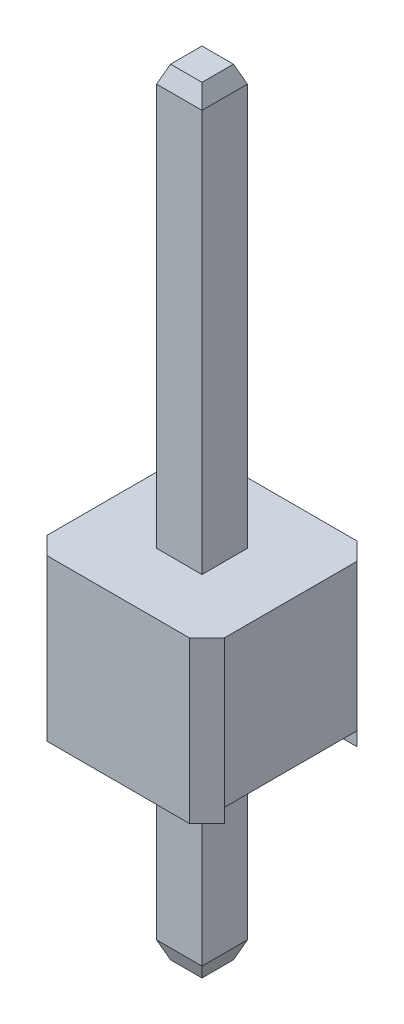
ISO-10303-21;
HEADER;
FILE_DESCRIPTION(('STEP AP214'),'2;1');
FILE_NAME('part.step','',(''),(''),'','','');
FILE_SCHEMA(('AUTOMOTIVE_DESIGN { 1 0 10303 214 1 1 1 1 }'));
ENDSEC;
DATA;
#1=APPLICATION_CONTEXT('core data for automotive mechanical design processes');
#2=APPLICATION_PROTOCOL_DEFINITION('international standard','automotive_design',2000,#1);
#3=PRODUCT_CONTEXT('',#1,'mechanical');
#4=PRODUCT('Part','Part','',(#3));
#5=PRODUCT_RELATED_PRODUCT_CATEGORY('part','',(#4));
#6=PRODUCT_DEFINITION_FORMATION('','',#4);
#7=PRODUCT_DEFINITION_CONTEXT('part definition',#1,'design');
#8=PRODUCT_DEFINITION('design','',#6,#7);
#9=PRODUCT_DEFINITION_SHAPE('','',#8);
#10=(LENGTH_UNIT() NAMED_UNIT(*) SI_UNIT(.MILLI.,.METRE.));
#11=(NAMED_UNIT(*) PLANE_ANGLE_UNIT() SI_UNIT($,.RADIAN.));
#12=(NAMED_UNIT(*) SI_UNIT($,.STERADIAN.) SOLID_ANGLE_UNIT());
#13=UNCERTAINTY_MEASURE_WITH_UNIT(LENGTH_MEASURE(1.E-05),#10,'distance_accuracy_value','');
#14=(GEOMETRIC_REPRESENTATION_CONTEXT(3) GLOBAL_UNCERTAINTY_ASSIGNED_CONTEXT((#13)) GLOBAL_UNIT_ASSIGNED_CONTEXT((#10,
#11,#12)) REPRESENTATION_CONTEXT('',''));
#15=CARTESIAN_POINT('',(0.,0.,0.));
#16=DIRECTION('',(0.,0.,1.));
#17=DIRECTION('',(1.,0.,0.));
#18=AXIS2_PLACEMENT_3D('',#15,#16,#17);
#19=CARTESIAN_POINT('',(0.65,11.3,0.65));
#20=DIRECTION('',(0.,0.,-1.));
#21=DIRECTION('',(0.,1.,0.));
#22=AXIS2_PLACEMENT_3D('',#19,#20,#21);
#23=PLANE('',#22);
#24=DIRECTION('',(0.,-1.,0.));
#25=VECTOR('',#24,1.);
#26=CARTESIAN_POINT('',(0.65,11.3,0.65));
#27=LINE('',#26,#25);
#28=CARTESIAN_POINT('',(0.65,11.0524913146584,0.65));
#29=VERTEX_POINT('',#28);
#30=CARTESIAN_POINT('',(0.649999999999999,5.3,0.65));
#31=VERTEX_POINT('',#30);
#32=EDGE_CURVE('E101',#29,#31,#27,.T.);
#33=ORIENTED_EDGE('',*,*,#32,.F.);
#34=DIRECTION('',(-1.,0.,0.));
#35=VECTOR('',#34,1.);
#36=CARTESIAN_POINT('',(0.65,11.0524913146584,0.65));
#37=LINE('',#36,#35);
#38=CARTESIAN_POINT('',(0.,11.0524913146584,0.65));
#39=VERTEX_POINT('',#38);
#40=EDGE_CURVE('E145',#29,#39,#37,.T.);
#41=ORIENTED_EDGE('',*,*,#40,.T.);
#42=DIRECTION('',(0.,-1.,0.));
#43=VECTOR('',#42,1.);
#44=CARTESIAN_POINT('',(0.,11.3,0.65));
#45=LINE('',#44,#43);
#46=CARTESIAN_POINT('',(0.,5.3,0.65));
#47=VERTEX_POINT('',#46);
#48=EDGE_CURVE('E121',#39,#47,#45,.T.);
#49=ORIENTED_EDGE('',*,*,#48,.T.);
#50=DIRECTION('',(1.,0.,0.));
#51=VECTOR('',#50,1.);
#52=CARTESIAN_POINT('',(0.649999999999999,5.3,0.65));
#53=LINE('',#52,#51);
#54=EDGE_CURVE('E116',#47,#31,#53,.T.);
#55=ORIENTED_EDGE('',*,*,#54,.T.);
#56=EDGE_LOOP('',(#33,#41,#49,#55));
#57=FACE_BOUND('',#56,.T.);
#58=ADVANCED_FACE('F50',(#57),#23,.F.);
#59=CARTESIAN_POINT('',(0.65,11.3,0.));
#60=DIRECTION('',(-1.,0.,0.));
#61=DIRECTION('',(0.,-1.,0.));
#62=AXIS2_PLACEMENT_3D('',#59,#60,#61);
#63=PLANE('',#62);
#64=DIRECTION('',(0.,-1.,0.));
#65=VECTOR('',#64,1.);
#66=CARTESIAN_POINT('',(0.65,11.3,0.));
#67=LINE('',#66,#65);
#68=CARTESIAN_POINT('',(0.65,11.0524913146584,0.));
#69=VERTEX_POINT('',#68);
#70=CARTESIAN_POINT('',(0.649999999999999,5.3,0.));
#71=VERTEX_POINT('',#70);
#72=EDGE_CURVE('E110',#69,#71,#67,.T.);
#73=ORIENTED_EDGE('',*,*,#72,.F.);
#74=DIRECTION('',(0.,0.,1.));
#75=VECTOR('',#74,1.);
#76=CARTESIAN_POINT('',(0.65,11.0524913146584,0.));
#77=LINE('',#76,#75);
#78=EDGE_CURVE('E12',#69,#29,#77,.T.);
#79=ORIENTED_EDGE('',*,*,#78,.T.);
#80=ORIENTED_EDGE('',*,*,#32,.T.);
#81=DIRECTION('',(0.,0.,-1.));
#82=VECTOR('',#81,1.);
#83=CARTESIAN_POINT('',(0.649999999999999,5.3,0.));
#84=LINE('',#83,#82);
#85=EDGE_CURVE('E104',#31,#71,#84,.T.);
#86=ORIENTED_EDGE('',*,*,#85,.T.);
#87=EDGE_LOOP('',(#73,#79,#80,#86));
#88=FACE_BOUND('',#87,.T.);
#89=ADVANCED_FACE('F103',(#88),#63,.F.);
#90=CARTESIAN_POINT('',(0.,11.3,0.));
#91=DIRECTION('',(0.,0.,1.));
#92=DIRECTION('',(0.,-1.,0.));
#93=AXIS2_PLACEMENT_3D('',#90,#91,#92);
#94=PLANE('',#93);
#95=DIRECTION('',(0.,-1.,0.));
#96=VECTOR('',#95,1.);
#97=CARTESIAN_POINT('',(0.,11.3,0.));
#98=LINE('',#97,#96);
#99=CARTESIAN_POINT('',(0.,11.0524913146584,0.));
#100=VERTEX_POINT('',#99);
#101=CARTESIAN_POINT('',(0.,5.3,0.));
#102=VERTEX_POINT('',#101);
#103=EDGE_CURVE('E131',#100,#102,#98,.T.);
#104=ORIENTED_EDGE('',*,*,#103,.F.);
#105=DIRECTION('',(1.,0.,0.));
#106=VECTOR('',#105,1.);
#107=CARTESIAN_POINT('',(0.,11.0524913146584,0.));
#108=LINE('',#107,#106);
#109=EDGE_CURVE('E59',#100,#69,#108,.T.);
#110=ORIENTED_EDGE('',*,*,#109,.T.);
#111=ORIENTED_EDGE('',*,*,#72,.T.);
#112=DIRECTION('',(-1.,0.,0.));
#113=VECTOR('',#112,1.);
#114=CARTESIAN_POINT('',(0.,5.3,0.));
#115=LINE('',#114,#113);
#116=EDGE_CURVE('E118',#71,#102,#115,.T.);
#117=ORIENTED_EDGE('',*,*,#116,.T.);
#118=EDGE_LOOP('',(#104,#110,#111,#117));
#119=FACE_BOUND('',#118,.T.);
#120=ADVANCED_FACE('F170',(#119),#94,.F.);
#121=CARTESIAN_POINT('',(0.,11.3,0.65));
#122=DIRECTION('',(1.,0.,0.));
#123=DIRECTION('',(0.,1.,0.));
#124=AXIS2_PLACEMENT_3D('',#121,#122,#123);
#125=PLANE('',#124);
#126=ORIENTED_EDGE('',*,*,#48,.F.);
#127=DIRECTION('',(0.,0.,-1.));
#128=VECTOR('',#127,1.);
#129=CARTESIAN_POINT('',(0.,11.0524913146584,0.65));
#130=LINE('',#129,#128);
#131=EDGE_CURVE('E142',#39,#100,#130,.T.);
#132=ORIENTED_EDGE('',*,*,#131,.T.);
#133=ORIENTED_EDGE('',*,*,#103,.T.);
#134=DIRECTION('',(0.,0.,1.));
#135=VECTOR('',#134,1.);
#136=CARTESIAN_POINT('',(0.,5.3,0.65));
#137=LINE('',#136,#135);
#138=EDGE_CURVE('E128',#102,#47,#137,.T.);
#139=ORIENTED_EDGE('',*,*,#138,.T.);
#140=EDGE_LOOP('',(#126,#132,#133,#139));
#141=FACE_BOUND('',#140,.T.);
#142=ADVANCED_FACE('F169',(#141),#125,.F.);
#143=CARTESIAN_POINT('',(0.,11.3,0.));
#144=DIRECTION('',(0.,-1.,0.));
#145=DIRECTION('',(0.,0.,-1.));
#146=AXIS2_PLACEMENT_3D('',#143,#144,#145);
#147=PLANE('',#146);
#148=DIRECTION('',(-1.,0.,0.));
#149=VECTOR('',#148,1.);
#150=CARTESIAN_POINT('',(0.,11.3,0.100000000000001));
#151=LINE('',#150,#149);
#152=CARTESIAN_POINT('',(0.549999999999999,11.3,0.100000000000001));
#153=VERTEX_POINT('',#152);
#154=CARTESIAN_POINT('',(0.100000000000001,11.3,0.100000000000001));
#155=VERTEX_POINT('',#154);
#156=EDGE_CURVE('E135',#153,#155,#151,.T.);
#157=ORIENTED_EDGE('',*,*,#156,.T.);
#158=DIRECTION('',(0.,0.,1.));
#159=VECTOR('',#158,1.);
#160=CARTESIAN_POINT('',(0.100000000000001,11.3,0.));
#161=LINE('',#160,#159);
#162=CARTESIAN_POINT('',(0.100000000000001,11.3,0.549999999999999));
#163=VERTEX_POINT('',#162);
#164=EDGE_CURVE('E139',#155,#163,#161,.T.);
#165=ORIENTED_EDGE('',*,*,#164,.T.);
#166=DIRECTION('',(1.,0.,0.));
#167=VECTOR('',#166,1.);
#168=CARTESIAN_POINT('',(0.,11.3,0.549999999999999));
#169=LINE('',#168,#167);
#170=CARTESIAN_POINT('',(0.549999999999999,11.3,0.549999999999999));
#171=VERTEX_POINT('',#170);
#172=EDGE_CURVE('E137',#163,#171,#169,.T.);
#173=ORIENTED_EDGE('',*,*,#172,.T.);
#174=DIRECTION('',(0.,0.,-1.));
#175=VECTOR('',#174,1.);
#176=CARTESIAN_POINT('',(0.549999999999999,11.3,0.));
#177=LINE('',#176,#175);
#178=EDGE_CURVE('E109',#171,#153,#177,.T.);
#179=ORIENTED_EDGE('',*,*,#178,.T.);
#180=EDGE_LOOP('',(#157,#165,#173,#179));
#181=FACE_BOUND('',#180,.T.);
#182=ADVANCED_FACE('F162',(#181),#147,.F.);
#183=CARTESIAN_POINT('',(0.,5.3,0.));
#184=DIRECTION('',(0.,-1.,0.));
#185=DIRECTION('',(0.,0.,-1.));
#186=AXIS2_PLACEMENT_3D('',#183,#184,#185);
#187=PLANE('',#186);
#188=ORIENTED_EDGE('',*,*,#54,.F.);
#189=ORIENTED_EDGE('',*,*,#138,.F.);
#190=ORIENTED_EDGE('',*,*,#116,.F.);
#191=ORIENTED_EDGE('',*,*,#85,.F.);
#192=EDGE_LOOP('',(#188,#189,#190,#191));
#193=FACE_BOUND('',#192,.T.);
#194=ADVANCED_FACE('F114',(#193),#187,.T.);
#195=CARTESIAN_POINT('',(0.549999999999999,11.3,0.));
#196=DIRECTION('',(-0.927183854566789,-0.374606593415909,0.));
#197=DIRECTION('',(0.,0.,-1.));
#198=AXIS2_PLACEMENT_3D('',#195,#196,#197);
#199=PLANE('',#198);
#200=DIRECTION('',(0.350800434887314,-0.868261544562318,0.350800434887314));
#201=VECTOR('',#200,1.);
#202=CARTESIAN_POINT('',(0.482316480185578,11.4675225900856,0.482316480185578));
#203=LINE('',#202,#201);
#204=EDGE_CURVE('E125',#29,#171,#203,.F.);
#205=ORIENTED_EDGE('',*,*,#204,.F.);
#206=ORIENTED_EDGE('',*,*,#78,.F.);
#207=DIRECTION('',(-0.350800434887314,0.868261544562318,0.350800434887314));
#208=VECTOR('',#207,1.);
#209=CARTESIAN_POINT('',(0.562306094511712,11.2695413472572,0.0876939054882881));
#210=LINE('',#209,#208);
#211=EDGE_CURVE('E54',#153,#69,#210,.F.);
#212=ORIENTED_EDGE('',*,*,#211,.F.);
#213=ORIENTED_EDGE('',*,*,#178,.F.);
#214=EDGE_LOOP('',(#205,#206,#212,#213));
#215=FACE_BOUND('',#214,.T.);
#216=ADVANCED_FACE('F52',(#215),#199,.F.);
#217=CARTESIAN_POINT('',(0.,11.3,0.100000000000001));
#218=DIRECTION('',(0.,-0.374606593415909,0.927183854566789));
#219=DIRECTION('',(-1.,0.,0.));
#220=AXIS2_PLACEMENT_3D('',#217,#218,#219);
#221=PLANE('',#220);
#222=ORIENTED_EDGE('',*,*,#211,.T.);
#223=ORIENTED_EDGE('',*,*,#109,.F.);
#224=DIRECTION('',(0.350800434887314,0.868261544562318,0.350800434887314));
#225=VECTOR('',#224,1.);
#226=CARTESIAN_POINT('',(0.0876939054882883,11.2695413472572,0.0876939054882882));
#227=LINE('',#226,#225);
#228=EDGE_CURVE('E150',#155,#100,#227,.F.);
#229=ORIENTED_EDGE('',*,*,#228,.F.);
#230=ORIENTED_EDGE('',*,*,#156,.F.);
#231=EDGE_LOOP('',(#222,#223,#229,#230));
#232=FACE_BOUND('',#231,.T.);
#233=ADVANCED_FACE('F188',(#232),#221,.F.);
#234=CARTESIAN_POINT('',(0.,11.3,0.549999999999999));
#235=DIRECTION('',(0.,-0.374606593415909,-0.927183854566789));
#236=DIRECTION('',(1.,0.,0.));
#237=AXIS2_PLACEMENT_3D('',#234,#235,#236);
#238=PLANE('',#237);
#239=ORIENTED_EDGE('',*,*,#204,.T.);
#240=ORIENTED_EDGE('',*,*,#172,.F.);
#241=DIRECTION('',(-0.350800434887314,-0.868261544562318,0.350800434887314));
#242=VECTOR('',#241,1.);
#243=CARTESIAN_POINT('',(0.0876939054882883,11.2695413472572,0.562306094511712));
#244=LINE('',#243,#242);
#245=EDGE_CURVE('E148',#39,#163,#244,.F.);
#246=ORIENTED_EDGE('',*,*,#245,.F.);
#247=ORIENTED_EDGE('',*,*,#40,.F.);
#248=EDGE_LOOP('',(#239,#240,#246,#247));
#249=FACE_BOUND('',#248,.T.);
#250=ADVANCED_FACE('F155',(#249),#238,.F.);
#251=CARTESIAN_POINT('',(0.100000000000001,11.3,0.));
#252=DIRECTION('',(0.927183854566789,-0.374606593415909,0.));
#253=DIRECTION('',(0.,0.,1.));
#254=AXIS2_PLACEMENT_3D('',#251,#252,#253);
#255=PLANE('',#254);
#256=ORIENTED_EDGE('',*,*,#228,.T.);
#257=ORIENTED_EDGE('',*,*,#131,.F.);
#258=ORIENTED_EDGE('',*,*,#245,.T.);
#259=ORIENTED_EDGE('',*,*,#164,.F.);
#260=EDGE_LOOP('',(#256,#257,#258,#259));
#261=FACE_BOUND('',#260,.T.);
#262=ADVANCED_FACE('F166',(#261),#255,.F.);
#263=CLOSED_SHELL('',(#58,#89,#120,#142,#182,#194,#216,#233,#250,#262));
#264=MANIFOLD_SOLID_BREP('B2',#263);
#265=CARTESIAN_POINT('',(0.,0.2,0.65));
#266=DIRECTION('',(0.,0.,-1.));
#267=DIRECTION('',(0.,1.,0.));
#268=AXIS2_PLACEMENT_3D('',#265,#266,#267);
#269=PLANE('',#268);
#270=DIRECTION('',(0.,1.,0.));
#271=VECTOR('',#270,1.);
#272=CARTESIAN_POINT('',(0.,0.2,0.65));
#273=LINE('',#272,#271);
#274=CARTESIAN_POINT('',(0.,0.44750868534163,0.65));
#275=VERTEX_POINT('',#274);
#276=CARTESIAN_POINT('',(0.,3.2,0.65));
#277=VERTEX_POINT('',#276);
#278=EDGE_CURVE('E294',#275,#277,#273,.T.);
#279=ORIENTED_EDGE('',*,*,#278,.F.);
#280=DIRECTION('',(1.,0.,0.));
#281=VECTOR('',#280,1.);
#282=CARTESIAN_POINT('',(0.,0.44750868534163,0.65));
#283=LINE('',#282,#281);
#284=CARTESIAN_POINT('',(0.649999999999999,0.44750868534163,0.65));
#285=VERTEX_POINT('',#284);
#286=EDGE_CURVE('E48',#275,#285,#283,.T.);
#287=ORIENTED_EDGE('',*,*,#286,.T.);
#288=DIRECTION('',(0.,1.,0.));
#289=VECTOR('',#288,1.);
#290=CARTESIAN_POINT('',(0.649999999999999,0.2,0.65));
#291=LINE('',#290,#289);
#292=CARTESIAN_POINT('',(0.65,3.2,0.65));
#293=VERTEX_POINT('',#292);
#294=EDGE_CURVE('E311',#285,#293,#291,.T.);
#295=ORIENTED_EDGE('',*,*,#294,.T.);
#296=DIRECTION('',(-1.,0.,0.));
#297=VECTOR('',#296,1.);
#298=CARTESIAN_POINT('',(0.,3.2,0.65));
#299=LINE('',#298,#297);
#300=EDGE_CURVE('E307',#293,#277,#299,.T.);
#301=ORIENTED_EDGE('',*,*,#300,.T.);
#302=EDGE_LOOP('',(#279,#287,#295,#301));
#303=FACE_BOUND('',#302,.T.);
#304=ADVANCED_FACE('F243',(#303),#269,.F.);
#305=CARTESIAN_POINT('',(0.,0.2,0.));
#306=DIRECTION('',(1.,0.,0.));
#307=DIRECTION('',(0.,1.,0.));
#308=AXIS2_PLACEMENT_3D('',#305,#306,#307);
#309=PLANE('',#308);
#310=DIRECTION('',(0.,1.,0.));
#311=VECTOR('',#310,1.);
#312=CARTESIAN_POINT('',(0.,0.2,0.));
#313=LINE('',#312,#311);
#314=CARTESIAN_POINT('',(0.,0.44750868534163,0.));
#315=VERTEX_POINT('',#314);
#316=CARTESIAN_POINT('',(0.,3.2,0.));
#317=VERTEX_POINT('',#316);
#318=EDGE_CURVE('E301',#315,#317,#313,.T.);
#319=ORIENTED_EDGE('',*,*,#318,.F.);
#320=DIRECTION('',(0.,0.,1.));
#321=VECTOR('',#320,1.);
#322=CARTESIAN_POINT('',(0.,0.44750868534163,0.));
#323=LINE('',#322,#321);
#324=EDGE_CURVE('E252',#315,#275,#323,.T.);
#325=ORIENTED_EDGE('',*,*,#324,.T.);
#326=ORIENTED_EDGE('',*,*,#278,.T.);
#327=DIRECTION('',(0.,0.,-1.));
#328=VECTOR('',#327,1.);
#329=CARTESIAN_POINT('',(0.,3.2,0.));
#330=LINE('',#329,#328);
#331=EDGE_CURVE('E297',#277,#317,#330,.T.);
#332=ORIENTED_EDGE('',*,*,#331,.T.);
#333=EDGE_LOOP('',(#319,#325,#326,#332));
#334=FACE_BOUND('',#333,.T.);
#335=ADVANCED_FACE('F296',(#334),#309,.F.);
#336=CARTESIAN_POINT('',(0.649999999999999,0.2,0.));
#337=DIRECTION('',(0.,0.,1.));
#338=DIRECTION('',(0.,-1.,0.));
#339=AXIS2_PLACEMENT_3D('',#336,#337,#338);
#340=PLANE('',#339);
#341=DIRECTION('',(0.,1.,0.));
#342=VECTOR('',#341,1.);
#343=CARTESIAN_POINT('',(0.649999999999999,0.2,0.));
#344=LINE('',#343,#342);
#345=CARTESIAN_POINT('',(0.649999999999999,0.44750868534163,0.));
#346=VERTEX_POINT('',#345);
#347=CARTESIAN_POINT('',(0.65,3.2,0.));
#348=VERTEX_POINT('',#347);
#349=EDGE_CURVE('E321',#346,#348,#344,.T.);
#350=ORIENTED_EDGE('',*,*,#349,.F.);
#351=DIRECTION('',(-1.,0.,0.));
#352=VECTOR('',#351,1.);
#353=CARTESIAN_POINT('',(0.649999999999999,0.44750868534163,0.));
#354=LINE('',#353,#352);
#355=EDGE_CURVE('E332',#346,#315,#354,.T.);
#356=ORIENTED_EDGE('',*,*,#355,.T.);
#357=ORIENTED_EDGE('',*,*,#318,.T.);
#358=DIRECTION('',(1.,0.,0.));
#359=VECTOR('',#358,1.);
#360=CARTESIAN_POINT('',(0.65,3.2,0.));
#361=LINE('',#360,#359);
#362=EDGE_CURVE('E309',#317,#348,#361,.T.);
#363=ORIENTED_EDGE('',*,*,#362,.T.);
#364=EDGE_LOOP('',(#350,#356,#357,#363));
#365=FACE_BOUND('',#364,.T.);
#366=ADVANCED_FACE('F361',(#365),#340,.F.);
#367=CARTESIAN_POINT('',(0.649999999999999,0.2,0.65));
#368=DIRECTION('',(-1.,0.,0.));
#369=DIRECTION('',(0.,-1.,0.));
#370=AXIS2_PLACEMENT_3D('',#367,#368,#369);
#371=PLANE('',#370);
#372=ORIENTED_EDGE('',*,*,#294,.F.);
#373=DIRECTION('',(0.,0.,-1.));
#374=VECTOR('',#373,1.);
#375=CARTESIAN_POINT('',(0.649999999999999,0.44750868534163,0.65));
#376=LINE('',#375,#374);
#377=EDGE_CURVE('E335',#285,#346,#376,.T.);
#378=ORIENTED_EDGE('',*,*,#377,.T.);
#379=ORIENTED_EDGE('',*,*,#349,.T.);
#380=DIRECTION('',(0.,0.,1.));
#381=VECTOR('',#380,1.);
#382=CARTESIAN_POINT('',(0.65,3.2,0.65));
#383=LINE('',#382,#381);
#384=EDGE_CURVE('E318',#348,#293,#383,.T.);
#385=ORIENTED_EDGE('',*,*,#384,.T.);
#386=EDGE_LOOP('',(#372,#378,#379,#385));
#387=FACE_BOUND('',#386,.T.);
#388=ADVANCED_FACE('F363',(#387),#371,.F.);
#389=CARTESIAN_POINT('',(0.,0.2,0.));
#390=DIRECTION('',(0.,1.,0.));
#391=DIRECTION('',(0.,0.,1.));
#392=AXIS2_PLACEMENT_3D('',#389,#390,#391);
#393=PLANE('',#392);
#394=DIRECTION('',(0.,0.,-1.));
#395=VECTOR('',#394,1.);
#396=CARTESIAN_POINT('',(0.0999999999999993,0.2,0.));
#397=LINE('',#396,#395);
#398=CARTESIAN_POINT('',(0.0999999999999993,0.2,0.55));
#399=VERTEX_POINT('',#398);
#400=CARTESIAN_POINT('',(0.0999999999999993,0.2,0.1));
#401=VERTEX_POINT('',#400);
#402=EDGE_CURVE('E325',#399,#401,#397,.T.);
#403=ORIENTED_EDGE('',*,*,#402,.T.);
#404=DIRECTION('',(1.,0.,0.));
#405=VECTOR('',#404,1.);
#406=CARTESIAN_POINT('',(0.,0.2,0.1));
#407=LINE('',#406,#405);
#408=CARTESIAN_POINT('',(0.549999999999999,0.2,0.1));
#409=VERTEX_POINT('',#408);
#410=EDGE_CURVE('E329',#401,#409,#407,.T.);
#411=ORIENTED_EDGE('',*,*,#410,.T.);
#412=DIRECTION('',(0.,0.,1.));
#413=VECTOR('',#412,1.);
#414=CARTESIAN_POINT('',(0.549999999999999,0.2,0.));
#415=LINE('',#414,#413);
#416=CARTESIAN_POINT('',(0.549999999999999,0.2,0.55));
#417=VERTEX_POINT('',#416);
#418=EDGE_CURVE('E327',#409,#417,#415,.T.);
#419=ORIENTED_EDGE('',*,*,#418,.T.);
#420=DIRECTION('',(-1.,0.,0.));
#421=VECTOR('',#420,1.);
#422=CARTESIAN_POINT('',(0.,0.2,0.55));
#423=LINE('',#422,#421);
#424=EDGE_CURVE('E300',#417,#399,#423,.T.);
#425=ORIENTED_EDGE('',*,*,#424,.T.);
#426=EDGE_LOOP('',(#403,#411,#419,#425));
#427=FACE_BOUND('',#426,.T.);
#428=ADVANCED_FACE('F353',(#427),#393,.F.);
#429=CARTESIAN_POINT('',(0.,3.2,0.));
#430=DIRECTION('',(0.,1.,0.));
#431=DIRECTION('',(0.,0.,1.));
#432=AXIS2_PLACEMENT_3D('',#429,#430,#431);
#433=PLANE('',#432);
#434=ORIENTED_EDGE('',*,*,#300,.F.);
#435=ORIENTED_EDGE('',*,*,#384,.F.);
#436=ORIENTED_EDGE('',*,*,#362,.F.);
#437=ORIENTED_EDGE('',*,*,#331,.F.);
#438=EDGE_LOOP('',(#434,#435,#436,#437));
#439=FACE_BOUND('',#438,.T.);
#440=ADVANCED_FACE('F305',(#439),#433,.T.);
#441=CARTESIAN_POINT('',(0.,0.2,0.55));
#442=DIRECTION('',(0.,0.374606593415913,-0.927183854566787));
#443=DIRECTION('',(-1.,0.,0.));
#444=AXIS2_PLACEMENT_3D('',#441,#442,#443);
#445=PLANE('',#444);
#446=DIRECTION('',(0.350800434887317,0.868261544562316,0.350800434887317));
#447=VECTOR('',#446,1.);
#448=CARTESIAN_POINT('',(0.482316480185577,0.0324774099143837,0.482316480185578));
#449=LINE('',#448,#447);
#450=EDGE_CURVE('E315',#285,#417,#449,.F.);
#451=ORIENTED_EDGE('',*,*,#450,.F.);
#452=ORIENTED_EDGE('',*,*,#286,.F.);
#453=DIRECTION('',(0.350800434887317,-0.868261544562316,-0.350800434887317));
#454=VECTOR('',#453,1.);
#455=CARTESIAN_POINT('',(0.0876939054882863,0.230458652742839,0.562306094511713));
#456=LINE('',#455,#454);
#457=EDGE_CURVE('E247',#399,#275,#456,.F.);
#458=ORIENTED_EDGE('',*,*,#457,.F.);
#459=ORIENTED_EDGE('',*,*,#424,.F.);
#460=EDGE_LOOP('',(#451,#452,#458,#459));
#461=FACE_BOUND('',#460,.T.);
#462=ADVANCED_FACE('F245',(#461),#445,.F.);
#463=CARTESIAN_POINT('',(0.0999999999999993,0.2,0.));
#464=DIRECTION('',(0.927183854566787,0.374606593415913,0.));
#465=DIRECTION('',(0.,0.,-1.));
#466=AXIS2_PLACEMENT_3D('',#463,#464,#465);
#467=PLANE('',#466);
#468=ORIENTED_EDGE('',*,*,#457,.T.);
#469=ORIENTED_EDGE('',*,*,#324,.F.);
#470=DIRECTION('',(0.350800434887317,-0.868261544562316,0.350800434887317));
#471=VECTOR('',#470,1.);
#472=CARTESIAN_POINT('',(0.0876939054882862,0.23045865274284,0.0876939054882873));
#473=LINE('',#472,#471);
#474=EDGE_CURVE('E340',#401,#315,#473,.F.);
#475=ORIENTED_EDGE('',*,*,#474,.F.);
#476=ORIENTED_EDGE('',*,*,#402,.F.);
#477=EDGE_LOOP('',(#468,#469,#475,#476));
#478=FACE_BOUND('',#477,.T.);
#479=ADVANCED_FACE('F384',(#478),#467,.F.);
#480=CARTESIAN_POINT('',(0.549999999999999,0.2,0.));
#481=DIRECTION('',(-0.927183854566787,0.374606593415912,0.));
#482=DIRECTION('',(0.,0.,1.));
#483=AXIS2_PLACEMENT_3D('',#480,#481,#482);
#484=PLANE('',#483);
#485=ORIENTED_EDGE('',*,*,#450,.T.);
#486=ORIENTED_EDGE('',*,*,#418,.F.);
#487=DIRECTION('',(0.350800434887317,0.868261544562316,-0.350800434887317));
#488=VECTOR('',#487,1.);
#489=CARTESIAN_POINT('',(0.562306094511712,0.23045865274284,0.0876939054882873));
#490=LINE('',#489,#488);
#491=EDGE_CURVE('E338',#346,#409,#490,.F.);
#492=ORIENTED_EDGE('',*,*,#491,.F.);
#493=ORIENTED_EDGE('',*,*,#377,.F.);
#494=EDGE_LOOP('',(#485,#486,#492,#493));
#495=FACE_BOUND('',#494,.T.);
#496=ADVANCED_FACE('F346',(#495),#484,.F.);
#497=CARTESIAN_POINT('',(0.,0.2,0.1));
#498=DIRECTION('',(0.,0.374606593415913,0.927183854566787));
#499=DIRECTION('',(1.,0.,0.));
#500=AXIS2_PLACEMENT_3D('',#497,#498,#499);
#501=PLANE('',#500);
#502=ORIENTED_EDGE('',*,*,#474,.T.);
#503=ORIENTED_EDGE('',*,*,#355,.F.);
#504=ORIENTED_EDGE('',*,*,#491,.T.);
#505=ORIENTED_EDGE('',*,*,#410,.F.);
#506=EDGE_LOOP('',(#502,#503,#504,#505));
#507=FACE_BOUND('',#506,.T.);
#508=ADVANCED_FACE('F357',(#507),#501,.F.);
#509=CLOSED_SHELL('',(#304,#335,#366,#388,#428,#440,#462,#479,#496,#508));
#510=MANIFOLD_SOLID_BREP('B6',#509);
#511=CARTESIAN_POINT('',(0.,3.2,0.));
#512=DIRECTION('',(0.,-1.,0.));
#513=DIRECTION('',(0.,0.,-1.));
#514=AXIS2_PLACEMENT_3D('',#511,#512,#513);
#515=PLANE('',#514);
#516=DIRECTION('',(0.,0.,-1.));
#517=VECTOR('',#516,1.);
#518=CARTESIAN_POINT('',(-0.945,3.2,1.525));
#519=LINE('',#518,#517);
#520=CARTESIAN_POINT('',(-0.945000000000001,3.2,1.275));
#521=VERTEX_POINT('',#520);
#522=CARTESIAN_POINT('',(-0.945000000000005,3.2,-0.624999999999996));
#523=VERTEX_POINT('',#522);
#524=EDGE_CURVE('E545',#521,#523,#519,.T.);
#525=ORIENTED_EDGE('',*,*,#524,.T.);
#526=DIRECTION('',(-1.,0.,0.));
#527=VECTOR('',#526,1.);
#528=CARTESIAN_POINT('',(-0.945000000000006,3.2,-0.624999999999996));
#529=LINE('',#528,#527);
#530=CARTESIAN_POINT('',(1.595,3.2,-0.624999999999996));
#531=VERTEX_POINT('',#530);
#532=EDGE_CURVE('E522',#531,#523,#529,.T.);
#533=ORIENTED_EDGE('',*,*,#532,.F.);
#534=DIRECTION('',(0.,0.,1.));
#535=VECTOR('',#534,1.);
#536=CARTESIAN_POINT('',(1.595,3.2,-0.875));
#537=LINE('',#536,#535);
#538=CARTESIAN_POINT('',(1.595,3.2,1.275));
#539=VERTEX_POINT('',#538);
#540=EDGE_CURVE('E550',#531,#539,#537,.T.);
#541=ORIENTED_EDGE('',*,*,#540,.T.);
#542=DIRECTION('',(1.,0.,0.));
#543=VECTOR('',#542,1.);
#544=CARTESIAN_POINT('',(1.595,3.2,1.275));
#545=LINE('',#544,#543);
#546=EDGE_CURVE('E524',#521,#539,#545,.T.);
#547=ORIENTED_EDGE('',*,*,#546,.F.);
#548=EDGE_LOOP('',(#525,#533,#541,#547));
#549=FACE_BOUND('',#548,.T.);
#550=ADVANCED_FACE('F427',(#549),#515,.T.);
#551=CARTESIAN_POINT('',(1.345,5.3,1.525));
#552=DIRECTION('',(0.,0.,1.));
#553=DIRECTION('',(1.,0.,0.));
#554=AXIS2_PLACEMENT_3D('',#551,#552,#553);
#555=PLANE('',#554);
#556=DIRECTION('',(-1.,0.,0.));
#557=VECTOR('',#556,1.);
#558=CARTESIAN_POINT('',(1.345,5.3,1.525));
#559=LINE('',#558,#557);
#560=CARTESIAN_POINT('',(1.345,5.3,1.525));
#561=VERTEX_POINT('',#560);
#562=CARTESIAN_POINT('',(-0.694999999999999,5.3,1.525));
#563=VERTEX_POINT('',#562);
#564=EDGE_CURVE('E546',#561,#563,#559,.T.);
#565=ORIENTED_EDGE('',*,*,#564,.T.);
#566=DIRECTION('',(0.,-1.,0.));
#567=VECTOR('',#566,1.);
#568=CARTESIAN_POINT('',(-0.694999999999999,5.3,1.525));
#569=LINE('',#568,#567);
#570=CARTESIAN_POINT('',(-0.694999999999999,3.,1.525));
#571=VERTEX_POINT('',#570);
#572=EDGE_CURVE('E567',#563,#571,#569,.T.);
#573=ORIENTED_EDGE('',*,*,#572,.T.);
#574=DIRECTION('',(-1.,0.,0.));
#575=VECTOR('',#574,1.);
#576=CARTESIAN_POINT('',(-0.945000000000001,3.,1.525));
#577=LINE('',#576,#575);
#578=CARTESIAN_POINT('',(1.345,3.,1.525));
#579=VERTEX_POINT('',#578);
#580=EDGE_CURVE('E536',#579,#571,#577,.T.);
#581=ORIENTED_EDGE('',*,*,#580,.F.);
#582=DIRECTION('',(0.,-1.,0.));
#583=VECTOR('',#582,1.);
#584=CARTESIAN_POINT('',(1.345,5.3,1.525));
#585=LINE('',#584,#583);
#586=EDGE_CURVE('E565',#561,#579,#585,.T.);
#587=ORIENTED_EDGE('',*,*,#586,.F.);
#588=EDGE_LOOP('',(#565,#573,#581,#587));
#589=FACE_BOUND('',#588,.T.);
#590=ADVANCED_FACE('F616',(#589),#555,.T.);
#591=CARTESIAN_POINT('',(1.595,5.3,1.275));
#592=DIRECTION('',(0.707106781186545,0.,0.70710678118655));
#593=DIRECTION('',(0.70710678118655,0.,-0.707106781186545));
#594=AXIS2_PLACEMENT_3D('',#591,#592,#593);
#595=PLANE('',#594);
#596=ORIENTED_EDGE('',*,*,#586,.T.);
#597=DIRECTION('',(-0.70710678118655,0.,0.707106781186545));
#598=VECTOR('',#597,1.);
#599=CARTESIAN_POINT('',(1.345,3.,1.525));
#600=LINE('',#599,#598);
#601=CARTESIAN_POINT('',(1.595,3.,1.275));
#602=VERTEX_POINT('',#601);
#603=EDGE_CURVE('E533',#602,#579,#600,.T.);
#604=ORIENTED_EDGE('',*,*,#603,.F.);
#605=DIRECTION('',(0.,1.,0.));
#606=VECTOR('',#605,1.);
#607=CARTESIAN_POINT('',(1.595,3.,1.275));
#608=LINE('',#607,#606);
#609=EDGE_CURVE('E538',#602,#539,#608,.T.);
#610=ORIENTED_EDGE('',*,*,#609,.T.);
#611=DIRECTION('',(0.,-1.,0.));
#612=VECTOR('',#611,1.);
#613=CARTESIAN_POINT('',(1.595,5.3,1.275));
#614=LINE('',#613,#612);
#615=CARTESIAN_POINT('',(1.595,5.3,1.275));
#616=VERTEX_POINT('',#615);
#617=EDGE_CURVE('E568',#616,#539,#614,.T.);
#618=ORIENTED_EDGE('',*,*,#617,.F.);
#619=DIRECTION('',(-0.70710678118655,0.,0.707106781186545));
#620=VECTOR('',#619,1.);
#621=CARTESIAN_POINT('',(1.595,5.3,1.275));
#622=LINE('',#621,#620);
#623=EDGE_CURVE('E559',#616,#561,#622,.T.);
#624=ORIENTED_EDGE('',*,*,#623,.T.);
#625=EDGE_LOOP('',(#596,#604,#610,#618,#624));
#626=FACE_BOUND('',#625,.T.);
#627=ADVANCED_FACE('F611',(#626),#595,.T.);
#628=CARTESIAN_POINT('',(1.595,5.3,-0.875));
#629=DIRECTION('',(1.,0.,0.));
#630=DIRECTION('',(0.,0.,-1.));
#631=AXIS2_PLACEMENT_3D('',#628,#629,#630);
#632=PLANE('',#631);
#633=ORIENTED_EDGE('',*,*,#540,.F.);
#634=DIRECTION('',(0.,1.,0.));
#635=VECTOR('',#634,1.);
#636=CARTESIAN_POINT('',(1.595,5.3,-0.624999999999995));
#637=LINE('',#636,#635);
#638=CARTESIAN_POINT('',(1.595,5.3,-0.624999999999995));
#639=VERTEX_POINT('',#638);
#640=EDGE_CURVE('E241',#531,#639,#637,.T.);
#641=ORIENTED_EDGE('',*,*,#640,.T.);
#642=DIRECTION('',(0.,0.,1.));
#643=VECTOR('',#642,1.);
#644=CARTESIAN_POINT('',(1.595,5.3,-0.875));
#645=LINE('',#644,#643);
#646=EDGE_CURVE('E557',#639,#616,#645,.T.);
#647=ORIENTED_EDGE('',*,*,#646,.T.);
#648=ORIENTED_EDGE('',*,*,#617,.T.);
#649=EDGE_LOOP('',(#633,#641,#647,#648));
#650=FACE_BOUND('',#649,.T.);
#651=ADVANCED_FACE('F600',(#650),#632,.T.);
#652=CARTESIAN_POINT('',(-0.695000000000001,5.3,-0.875));
#653=DIRECTION('',(0.,0.,-1.));
#654=DIRECTION('',(-1.,0.,0.));
#655=AXIS2_PLACEMENT_3D('',#652,#653,#654);
#656=PLANE('',#655);
#657=DIRECTION('',(1.,0.,0.));
#658=VECTOR('',#657,1.);
#659=CARTESIAN_POINT('',(-0.695000000000001,5.3,-0.875));
#660=LINE('',#659,#658);
#661=CARTESIAN_POINT('',(-0.695000000000001,5.3,-0.875));
#662=VERTEX_POINT('',#661);
#663=CARTESIAN_POINT('',(1.345,5.3,-0.875));
#664=VERTEX_POINT('',#663);
#665=EDGE_CURVE('E555',#662,#664,#660,.T.);
#666=ORIENTED_EDGE('',*,*,#665,.T.);
#667=DIRECTION('',(0.,-1.,0.));
#668=VECTOR('',#667,1.);
#669=CARTESIAN_POINT('',(1.345,5.3,-0.875));
#670=LINE('',#669,#668);
#671=CARTESIAN_POINT('',(1.345,3.,-0.875));
#672=VERTEX_POINT('',#671);
#673=EDGE_CURVE('E511',#664,#672,#670,.T.);
#674=ORIENTED_EDGE('',*,*,#673,.T.);
#675=DIRECTION('',(1.,0.,0.));
#676=VECTOR('',#675,1.);
#677=CARTESIAN_POINT('',(1.595,3.,-0.875));
#678=LINE('',#677,#676);
#679=CARTESIAN_POINT('',(-0.695000000000002,3.,-0.875));
#680=VERTEX_POINT('',#679);
#681=EDGE_CURVE('E510',#680,#672,#678,.T.);
#682=ORIENTED_EDGE('',*,*,#681,.F.);
#683=DIRECTION('',(0.,-1.,0.));
#684=VECTOR('',#683,1.);
#685=CARTESIAN_POINT('',(-0.695000000000001,5.3,-0.875));
#686=LINE('',#685,#684);
#687=EDGE_CURVE('E571',#662,#680,#686,.T.);
#688=ORIENTED_EDGE('',*,*,#687,.F.);
#689=EDGE_LOOP('',(#666,#674,#682,#688));
#690=FACE_BOUND('',#689,.T.);
#691=ADVANCED_FACE('F585',(#690),#656,.T.);
#692=CARTESIAN_POINT('',(-0.945000000000005,5.3,-0.624999999999996));
#693=DIRECTION('',(-0.707106781186548,0.,-0.707106781186547));
#694=DIRECTION('',(-0.707106781186547,0.,0.707106781186548));
#695=AXIS2_PLACEMENT_3D('',#692,#693,#694);
#696=PLANE('',#695);
#697=ORIENTED_EDGE('',*,*,#687,.T.);
#698=DIRECTION('',(0.707106781186547,0.,-0.707106781186548));
#699=VECTOR('',#698,1.);
#700=CARTESIAN_POINT('',(-0.695000000000002,3.,-0.875));
#701=LINE('',#700,#699);
#702=CARTESIAN_POINT('',(-0.945000000000006,3.,-0.624999999999996));
#703=VERTEX_POINT('',#702);
#704=EDGE_CURVE('E521',#703,#680,#701,.T.);
#705=ORIENTED_EDGE('',*,*,#704,.F.);
#706=DIRECTION('',(0.,1.,0.));
#707=VECTOR('',#706,1.);
#708=CARTESIAN_POINT('',(-0.945000000000006,3.,-0.624999999999996));
#709=LINE('',#708,#707);
#710=EDGE_CURVE('E519',#703,#523,#709,.T.);
#711=ORIENTED_EDGE('',*,*,#710,.T.);
#712=DIRECTION('',(0.,-1.,0.));
#713=VECTOR('',#712,1.);
#714=CARTESIAN_POINT('',(-0.945000000000005,5.3,-0.624999999999996));
#715=LINE('',#714,#713);
#716=CARTESIAN_POINT('',(-0.945000000000005,5.3,-0.624999999999996));
#717=VERTEX_POINT('',#716);
#718=EDGE_CURVE('E562',#717,#523,#715,.T.);
#719=ORIENTED_EDGE('',*,*,#718,.F.);
#720=DIRECTION('',(0.707106781186547,0.,-0.707106781186548));
#721=VECTOR('',#720,1.);
#722=CARTESIAN_POINT('',(-0.945000000000005,5.3,-0.624999999999996));
#723=LINE('',#722,#721);
#724=EDGE_CURVE('E552',#717,#662,#723,.T.);
#725=ORIENTED_EDGE('',*,*,#724,.T.);
#726=EDGE_LOOP('',(#697,#705,#711,#719,#725));
#727=FACE_BOUND('',#726,.T.);
#728=ADVANCED_FACE('F591',(#727),#696,.T.);
#729=CARTESIAN_POINT('',(-0.945,5.3,1.525));
#730=DIRECTION('',(-1.,0.,0.));
#731=DIRECTION('',(0.,0.,1.));
#732=AXIS2_PLACEMENT_3D('',#729,#730,#731);
#733=PLANE('',#732);
#734=ORIENTED_EDGE('',*,*,#524,.F.);
#735=DIRECTION('',(0.,1.,0.));
#736=VECTOR('',#735,1.);
#737=CARTESIAN_POINT('',(-0.945000000000001,5.3,1.275));
#738=LINE('',#737,#736);
#739=CARTESIAN_POINT('',(-0.945000000000001,5.3,1.275));
#740=VERTEX_POINT('',#739);
#741=EDGE_CURVE('E579',#521,#740,#738,.T.);
#742=ORIENTED_EDGE('',*,*,#741,.T.);
#743=DIRECTION('',(0.,0.,-1.));
#744=VECTOR('',#743,1.);
#745=CARTESIAN_POINT('',(-0.945,5.3,1.525));
#746=LINE('',#745,#744);
#747=EDGE_CURVE('E549',#740,#717,#746,.T.);
#748=ORIENTED_EDGE('',*,*,#747,.T.);
#749=ORIENTED_EDGE('',*,*,#718,.T.);
#750=EDGE_LOOP('',(#734,#742,#748,#749));
#751=FACE_BOUND('',#750,.T.);
#752=ADVANCED_FACE('F594',(#751),#733,.T.);
#753=CARTESIAN_POINT('',(0.,5.3,0.));
#754=DIRECTION('',(0.,-1.,0.));
#755=DIRECTION('',(0.,0.,-1.));
#756=AXIS2_PLACEMENT_3D('',#753,#754,#755);
#757=PLANE('',#756);
#758=ORIENTED_EDGE('',*,*,#747,.F.);
#759=DIRECTION('',(-0.707106781186545,0.,-0.70710678118655));
#760=VECTOR('',#759,1.);
#761=CARTESIAN_POINT('',(-0.694999999999999,5.3,1.525));
#762=LINE('',#761,#760);
#763=EDGE_CURVE('E582',#740,#563,#762,.F.);
#764=ORIENTED_EDGE('',*,*,#763,.T.);
#765=ORIENTED_EDGE('',*,*,#564,.F.);
#766=ORIENTED_EDGE('',*,*,#623,.F.);
#767=ORIENTED_EDGE('',*,*,#646,.F.);
#768=DIRECTION('',(0.707106781186543,0.,0.707106781186552));
#769=VECTOR('',#768,1.);
#770=CARTESIAN_POINT('',(1.345,5.3,-0.875));
#771=LINE('',#770,#769);
#772=EDGE_CURVE('E449',#639,#664,#771,.F.);
#773=ORIENTED_EDGE('',*,*,#772,.T.);
#774=ORIENTED_EDGE('',*,*,#665,.F.);
#775=ORIENTED_EDGE('',*,*,#724,.F.);
#776=EDGE_LOOP('',(#758,#764,#765,#766,#767,#773,#774,#775));
#777=FACE_BOUND('',#776,.T.);
#778=ADVANCED_FACE('F588',(#777),#757,.F.);
#779=CARTESIAN_POINT('',(1.595,3.,1.275));
#780=DIRECTION('',(0.,0.,1.));
#781=DIRECTION('',(0.,-1.,0.));
#782=AXIS2_PLACEMENT_3D('',#779,#780,#781);
#783=PLANE('',#782);
#784=ORIENTED_EDGE('',*,*,#546,.T.);
#785=ORIENTED_EDGE('',*,*,#609,.F.);
#786=DIRECTION('',(1.,0.,0.));
#787=VECTOR('',#786,1.);
#788=CARTESIAN_POINT('',(1.595,3.,1.275));
#789=LINE('',#788,#787);
#790=CARTESIAN_POINT('',(-0.945000000000003,3.,1.275));
#791=VERTEX_POINT('',#790);
#792=EDGE_CURVE('E527',#791,#602,#789,.T.);
#793=ORIENTED_EDGE('',*,*,#792,.F.);
#794=DIRECTION('',(0.,1.,0.));
#795=VECTOR('',#794,1.);
#796=CARTESIAN_POINT('',(-0.945000000000003,3.,1.275));
#797=LINE('',#796,#795);
#798=EDGE_CURVE('E542',#791,#521,#797,.T.);
#799=ORIENTED_EDGE('',*,*,#798,.T.);
#800=EDGE_LOOP('',(#784,#785,#793,#799));
#801=FACE_BOUND('',#800,.T.);
#802=ADVANCED_FACE('F606',(#801),#783,.F.);
#803=CARTESIAN_POINT('',(0.,3.,0.));
#804=DIRECTION('',(0.,1.,0.));
#805=DIRECTION('',(-1.,0.,0.));
#806=AXIS2_PLACEMENT_3D('',#803,#804,#805);
#807=PLANE('',#806);
#808=ORIENTED_EDGE('',*,*,#580,.T.);
#809=DIRECTION('',(0.707106781186545,0.,0.70710678118655));
#810=VECTOR('',#809,1.);
#811=CARTESIAN_POINT('',(-0.694999999999999,3.,1.525));
#812=LINE('',#811,#810);
#813=EDGE_CURVE('E577',#571,#791,#812,.F.);
#814=ORIENTED_EDGE('',*,*,#813,.T.);
#815=ORIENTED_EDGE('',*,*,#792,.T.);
#816=ORIENTED_EDGE('',*,*,#603,.T.);
#817=EDGE_LOOP('',(#808,#814,#815,#816));
#818=FACE_BOUND('',#817,.T.);
#819=ADVANCED_FACE('F614',(#818),#807,.F.);
#820=CARTESIAN_POINT('',(-0.945000000000006,3.,-0.624999999999996));
#821=DIRECTION('',(0.,0.,-1.));
#822=DIRECTION('',(0.,1.,0.));
#823=AXIS2_PLACEMENT_3D('',#820,#821,#822);
#824=PLANE('',#823);
#825=ORIENTED_EDGE('',*,*,#532,.T.);
#826=ORIENTED_EDGE('',*,*,#710,.F.);
#827=DIRECTION('',(-1.,0.,0.));
#828=VECTOR('',#827,1.);
#829=CARTESIAN_POINT('',(-0.945000000000006,3.,-0.624999999999996));
#830=LINE('',#829,#828);
#831=CARTESIAN_POINT('',(1.595,3.,-0.624999999999996));
#832=VERTEX_POINT('',#831);
#833=EDGE_CURVE('E507',#832,#703,#830,.T.);
#834=ORIENTED_EDGE('',*,*,#833,.F.);
#835=DIRECTION('',(0.,1.,0.));
#836=VECTOR('',#835,1.);
#837=CARTESIAN_POINT('',(1.595,3.,-0.624999999999996));
#838=LINE('',#837,#836);
#839=EDGE_CURVE('E516',#832,#531,#838,.T.);
#840=ORIENTED_EDGE('',*,*,#839,.T.);
#841=EDGE_LOOP('',(#825,#826,#834,#840));
#842=FACE_BOUND('',#841,.T.);
#843=ADVANCED_FACE('F515',(#842),#824,.F.);
#844=CARTESIAN_POINT('',(0.,3.,0.));
#845=DIRECTION('',(0.,1.,0.));
#846=DIRECTION('',(-1.,0.,0.));
#847=AXIS2_PLACEMENT_3D('',#844,#845,#846);
#848=PLANE('',#847);
#849=ORIENTED_EDGE('',*,*,#681,.T.);
#850=DIRECTION('',(-0.707106781186543,0.,-0.707106781186552));
#851=VECTOR('',#850,1.);
#852=CARTESIAN_POINT('',(1.345,3.,-0.875));
#853=LINE('',#852,#851);
#854=EDGE_CURVE('E435',#672,#832,#853,.F.);
#855=ORIENTED_EDGE('',*,*,#854,.T.);
#856=ORIENTED_EDGE('',*,*,#833,.T.);
#857=ORIENTED_EDGE('',*,*,#704,.T.);
#858=EDGE_LOOP('',(#849,#855,#856,#857));
#859=FACE_BOUND('',#858,.T.);
#860=ADVANCED_FACE('F505',(#859),#848,.F.);
#861=CARTESIAN_POINT('',(-0.694999999999999,5.3,1.525));
#862=DIRECTION('',(0.70710678118655,0.,-0.707106781186545));
#863=DIRECTION('',(0.,-1.,0.));
#864=AXIS2_PLACEMENT_3D('',#861,#862,#863);
#865=PLANE('',#864);
#866=ORIENTED_EDGE('',*,*,#741,.F.);
#867=ORIENTED_EDGE('',*,*,#798,.F.);
#868=ORIENTED_EDGE('',*,*,#813,.F.);
#869=ORIENTED_EDGE('',*,*,#572,.F.);
#870=ORIENTED_EDGE('',*,*,#763,.F.);
#871=EDGE_LOOP('',(#866,#867,#868,#869,#870));
#872=FACE_BOUND('',#871,.T.);
#873=ADVANCED_FACE('F621',(#872),#865,.F.);
#874=CARTESIAN_POINT('',(1.345,5.3,-0.875));
#875=DIRECTION('',(-0.707106781186552,0.,0.707106781186543));
#876=DIRECTION('',(0.,-1.,0.));
#877=AXIS2_PLACEMENT_3D('',#874,#875,#876);
#878=PLANE('',#877);
#879=ORIENTED_EDGE('',*,*,#640,.F.);
#880=ORIENTED_EDGE('',*,*,#839,.F.);
#881=ORIENTED_EDGE('',*,*,#854,.F.);
#882=ORIENTED_EDGE('',*,*,#673,.F.);
#883=ORIENTED_EDGE('',*,*,#772,.F.);
#884=EDGE_LOOP('',(#879,#880,#881,#882,#883));
#885=FACE_BOUND('',#884,.T.);
#886=ADVANCED_FACE('F429',(#885),#878,.F.);
#887=CLOSED_SHELL('',(#550,#590,#627,#651,#691,#728,#752,#778,#802,#819,#843,#860,#873,#886));
#888=MANIFOLD_SOLID_BREP('B42',#887);
#889=ADVANCED_BREP_SHAPE_REPRESENTATION('',(#18,#264,#510,#888),#14);
#890=SHAPE_DEFINITION_REPRESENTATION(#9,#889);
ENDSEC;
END-ISO-10303-21;
